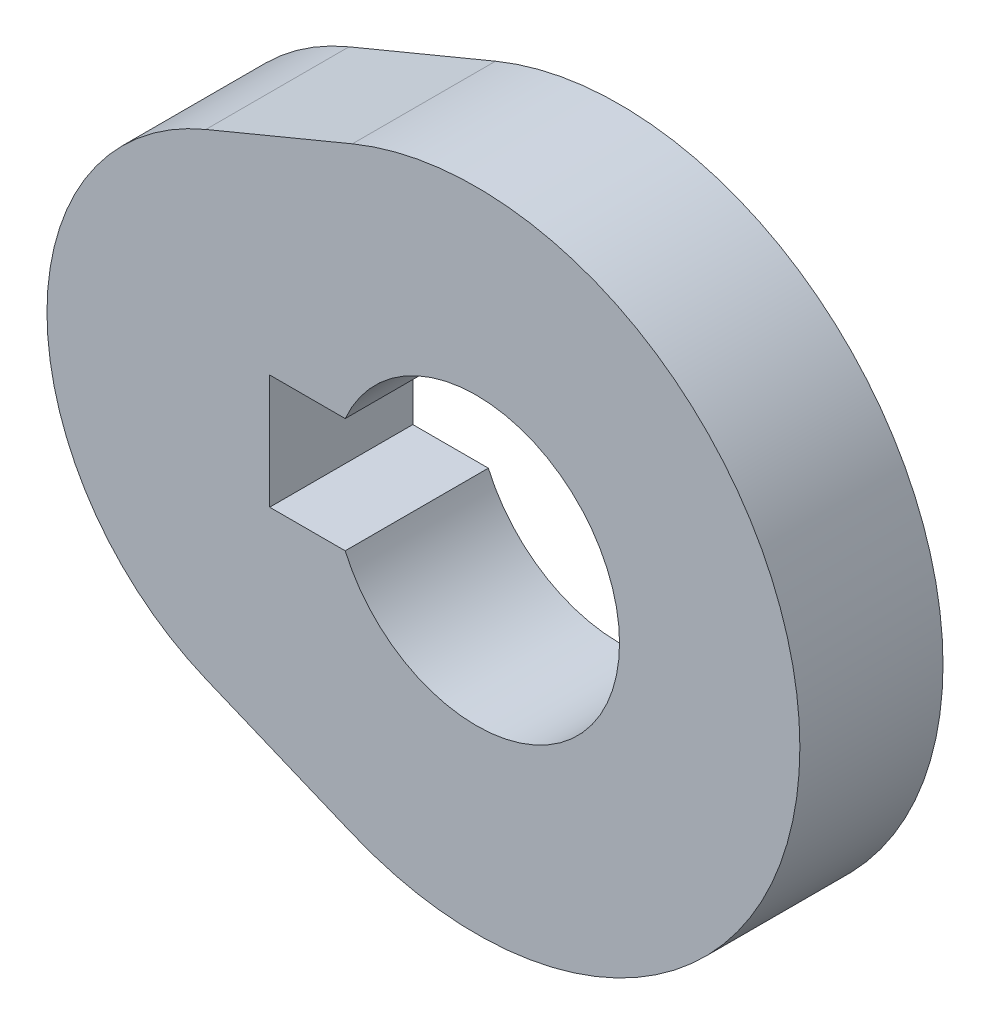
ISO-10303-21;
HEADER;
FILE_DESCRIPTION(('STEP AP214'),'2;1');
FILE_NAME('part.step','',(''),(''),'','','');
FILE_SCHEMA(('AUTOMOTIVE_DESIGN { 1 0 10303 214 1 1 1 1 }'));
ENDSEC;
DATA;
#1=APPLICATION_CONTEXT('core data for automotive mechanical design processes');
#2=APPLICATION_PROTOCOL_DEFINITION('international standard','automotive_design',2000,#1);
#3=PRODUCT_CONTEXT('',#1,'mechanical');
#4=PRODUCT('Part','Part','',(#3));
#5=PRODUCT_RELATED_PRODUCT_CATEGORY('part','',(#4));
#6=PRODUCT_DEFINITION_FORMATION('','',#4);
#7=PRODUCT_DEFINITION_CONTEXT('part definition',#1,'design');
#8=PRODUCT_DEFINITION('design','',#6,#7);
#9=PRODUCT_DEFINITION_SHAPE('','',#8);
#10=(LENGTH_UNIT() NAMED_UNIT(*) SI_UNIT(.MILLI.,.METRE.));
#11=(NAMED_UNIT(*) PLANE_ANGLE_UNIT() SI_UNIT($,.RADIAN.));
#12=(NAMED_UNIT(*) SI_UNIT($,.STERADIAN.) SOLID_ANGLE_UNIT());
#13=UNCERTAINTY_MEASURE_WITH_UNIT(LENGTH_MEASURE(1.E-05),#10,'distance_accuracy_value','');
#14=(GEOMETRIC_REPRESENTATION_CONTEXT(3) GLOBAL_UNCERTAINTY_ASSIGNED_CONTEXT((#13)) GLOBAL_UNIT_ASSIGNED_CONTEXT((#10,
#11,#12)) REPRESENTATION_CONTEXT('',''));
#15=CARTESIAN_POINT('',(0.,0.,0.));
#16=DIRECTION('',(0.,0.,1.));
#17=DIRECTION('',(1.,0.,0.));
#18=AXIS2_PLACEMENT_3D('',#15,#16,#17);
#19=CARTESIAN_POINT('',(-11.3,0.,5.));
#20=DIRECTION('',(0.,0.,-1.));
#21=DIRECTION('',(-1.,0.,0.));
#22=AXIS2_PLACEMENT_3D('',#19,#20,#21);
#23=CYLINDRICAL_SURFACE('',#22,5.);
#24=CARTESIAN_POINT('',(-11.3,0.,0.));
#25=DIRECTION('',(0.,0.,1.));
#26=DIRECTION('',(1.,0.,0.));
#27=AXIS2_PLACEMENT_3D('',#24,#25,#26);
#28=CIRCLE('',#27,5.);
#29=CARTESIAN_POINT('',(-15.8825756949558,-2.,0.));
#30=VERTEX_POINT('',#29);
#31=CARTESIAN_POINT('',(-15.8825756949558,2.,0.));
#32=VERTEX_POINT('',#31);
#33=EDGE_CURVE('E150',#30,#32,#28,.T.);
#34=ORIENTED_EDGE('',*,*,#33,.F.);
#35=DIRECTION('',(0.,0.,-1.));
#36=VECTOR('',#35,1.);
#37=CARTESIAN_POINT('',(-15.8825756949558,-2.,5.));
#38=LINE('',#37,#36);
#39=CARTESIAN_POINT('',(-15.8825756949558,-2.,5.));
#40=VERTEX_POINT('',#39);
#41=EDGE_CURVE('E11',#40,#30,#38,.T.);
#42=ORIENTED_EDGE('',*,*,#41,.F.);
#43=CARTESIAN_POINT('',(-11.3,0.,5.));
#44=DIRECTION('',(0.,0.,1.));
#45=DIRECTION('',(1.,0.,0.));
#46=AXIS2_PLACEMENT_3D('',#43,#44,#45);
#47=CIRCLE('',#46,5.);
#48=CARTESIAN_POINT('',(-15.8825756949558,2.,5.));
#49=VERTEX_POINT('',#48);
#50=EDGE_CURVE('E120',#40,#49,#47,.T.);
#51=ORIENTED_EDGE('',*,*,#50,.T.);
#52=DIRECTION('',(0.,0.,-1.));
#53=VECTOR('',#52,1.);
#54=CARTESIAN_POINT('',(-15.8825756949558,2.,5.));
#55=LINE('',#54,#53);
#56=EDGE_CURVE('E54',#49,#32,#55,.T.);
#57=ORIENTED_EDGE('',*,*,#56,.T.);
#58=EDGE_LOOP('',(#34,#42,#51,#57));
#59=FACE_BOUND('',#58,.T.);
#60=ADVANCED_FACE('F35',(#59),#23,.F.);
#61=CARTESIAN_POINT('',(0.,-2.,5.));
#62=DIRECTION('',(0.,-1.,0.));
#63=DIRECTION('',(1.,0.,0.));
#64=AXIS2_PLACEMENT_3D('',#61,#62,#63);
#65=PLANE('',#64);
#66=DIRECTION('',(-1.,0.,0.));
#67=VECTOR('',#66,1.);
#68=CARTESIAN_POINT('',(0.,-2.,0.));
#69=LINE('',#68,#67);
#70=CARTESIAN_POINT('',(-18.52,-2.,0.));
#71=VERTEX_POINT('',#70);
#72=EDGE_CURVE('E125',#30,#71,#69,.T.);
#73=ORIENTED_EDGE('',*,*,#72,.T.);
#74=DIRECTION('',(0.,0.,-1.));
#75=VECTOR('',#74,1.);
#76=CARTESIAN_POINT('',(-18.52,-2.,5.));
#77=LINE('',#76,#75);
#78=CARTESIAN_POINT('',(-18.52,-2.,5.));
#79=VERTEX_POINT('',#78);
#80=EDGE_CURVE('E45',#79,#71,#77,.T.);
#81=ORIENTED_EDGE('',*,*,#80,.F.);
#82=DIRECTION('',(-1.,0.,0.));
#83=VECTOR('',#82,1.);
#84=CARTESIAN_POINT('',(0.,-2.,5.));
#85=LINE('',#84,#83);
#86=EDGE_CURVE('E115',#40,#79,#85,.T.);
#87=ORIENTED_EDGE('',*,*,#86,.F.);
#88=ORIENTED_EDGE('',*,*,#41,.T.);
#89=EDGE_LOOP('',(#73,#81,#87,#88));
#90=FACE_BOUND('',#89,.T.);
#91=ADVANCED_FACE('F123',(#90),#65,.F.);
#92=CARTESIAN_POINT('',(-18.52,0.,5.));
#93=DIRECTION('',(-1.,0.,0.));
#94=DIRECTION('',(0.,0.,1.));
#95=AXIS2_PLACEMENT_3D('',#92,#93,#94);
#96=PLANE('',#95);
#97=DIRECTION('',(0.,1.,0.));
#98=VECTOR('',#97,1.);
#99=CARTESIAN_POINT('',(-18.52,0.,0.));
#100=LINE('',#99,#98);
#101=CARTESIAN_POINT('',(-18.52,2.,0.));
#102=VERTEX_POINT('',#101);
#103=EDGE_CURVE('E147',#71,#102,#100,.T.);
#104=ORIENTED_EDGE('',*,*,#103,.T.);
#105=DIRECTION('',(0.,0.,-1.));
#106=VECTOR('',#105,1.);
#107=CARTESIAN_POINT('',(-18.52,2.,5.));
#108=LINE('',#107,#106);
#109=CARTESIAN_POINT('',(-18.52,2.,5.));
#110=VERTEX_POINT('',#109);
#111=EDGE_CURVE('E80',#110,#102,#108,.T.);
#112=ORIENTED_EDGE('',*,*,#111,.F.);
#113=DIRECTION('',(0.,1.,0.));
#114=VECTOR('',#113,1.);
#115=CARTESIAN_POINT('',(-18.52,0.,5.));
#116=LINE('',#115,#114);
#117=EDGE_CURVE('E107',#79,#110,#116,.T.);
#118=ORIENTED_EDGE('',*,*,#117,.F.);
#119=ORIENTED_EDGE('',*,*,#80,.T.);
#120=EDGE_LOOP('',(#104,#112,#118,#119));
#121=FACE_BOUND('',#120,.T.);
#122=ADVANCED_FACE('F109',(#121),#96,.F.);
#123=CARTESIAN_POINT('',(-5.99213888888889,14.4375646947137,5.));
#124=DIRECTION('',(-0.383333333333333,0.923610066833161,0.));
#125=DIRECTION('',(-0.923610066833161,-0.383333333333333,0.));
#126=AXIS2_PLACEMENT_3D('',#123,#124,#125);
#127=PLANE('',#126);
#128=DIRECTION('',(0.923610066833161,0.383333333333333,0.));
#129=VECTOR('',#128,1.);
#130=CARTESIAN_POINT('',(-5.99213888888889,14.4375646947137,0.));
#131=LINE('',#130,#129);
#132=CARTESIAN_POINT('',(-20.75,8.31249060149844,0.));
#133=VERTEX_POINT('',#132);
#134=CARTESIAN_POINT('',(-15.6316666666667,10.4367937552147,0.));
#135=VERTEX_POINT('',#134);
#136=EDGE_CURVE('E159',#133,#135,#131,.T.);
#137=ORIENTED_EDGE('',*,*,#136,.F.);
#138=DIRECTION('',(0.,0.,-1.));
#139=VECTOR('',#138,1.);
#140=CARTESIAN_POINT('',(-20.75,8.31249060149844,5.));
#141=LINE('',#140,#139);
#142=CARTESIAN_POINT('',(-20.75,8.31249060149844,5.));
#143=VERTEX_POINT('',#142);
#144=EDGE_CURVE('E39',#143,#133,#141,.T.);
#145=ORIENTED_EDGE('',*,*,#144,.F.);
#146=DIRECTION('',(0.923610066833161,0.383333333333333,0.));
#147=VECTOR('',#146,1.);
#148=CARTESIAN_POINT('',(-5.99213888888889,14.4375646947137,5.));
#149=LINE('',#148,#147);
#150=CARTESIAN_POINT('',(-15.6316666666667,10.4367937552147,5.));
#151=VERTEX_POINT('',#150);
#152=EDGE_CURVE('E146',#143,#151,#149,.T.);
#153=ORIENTED_EDGE('',*,*,#152,.T.);
#154=DIRECTION('',(0.,0.,-1.));
#155=VECTOR('',#154,1.);
#156=CARTESIAN_POINT('',(-15.6316666666667,10.4367937552147,5.));
#157=LINE('',#156,#155);
#158=EDGE_CURVE('E130',#151,#135,#157,.T.);
#159=ORIENTED_EDGE('',*,*,#158,.T.);
#160=EDGE_LOOP('',(#137,#145,#153,#159));
#161=FACE_BOUND('',#160,.T.);
#162=ADVANCED_FACE('F37',(#161),#127,.T.);
#163=CARTESIAN_POINT('',(-17.3,0.,5.));
#164=DIRECTION('',(0.,0.,-1.));
#165=DIRECTION('',(-1.,0.,0.));
#166=AXIS2_PLACEMENT_3D('',#163,#164,#165);
#167=CYLINDRICAL_SURFACE('',#166,9.);
#168=CARTESIAN_POINT('',(-17.3,0.,0.));
#169=DIRECTION('',(0.,0.,1.));
#170=DIRECTION('',(1.,0.,0.));
#171=AXIS2_PLACEMENT_3D('',#168,#169,#170);
#172=CIRCLE('',#171,9.);
#173=CARTESIAN_POINT('',(-20.75,-8.31249060149844,0.));
#174=VERTEX_POINT('',#173);
#175=EDGE_CURVE('E157',#133,#174,#172,.T.);
#176=ORIENTED_EDGE('',*,*,#175,.T.);
#177=DIRECTION('',(0.,0.,-1.));
#178=VECTOR('',#177,1.);
#179=CARTESIAN_POINT('',(-20.75,-8.31249060149844,5.));
#180=LINE('',#179,#178);
#181=CARTESIAN_POINT('',(-20.75,-8.31249060149844,5.));
#182=VERTEX_POINT('',#181);
#183=EDGE_CURVE('E134',#182,#174,#180,.T.);
#184=ORIENTED_EDGE('',*,*,#183,.F.);
#185=CARTESIAN_POINT('',(-17.3,0.,5.));
#186=DIRECTION('',(0.,0.,1.));
#187=DIRECTION('',(1.,0.,0.));
#188=AXIS2_PLACEMENT_3D('',#185,#186,#187);
#189=CIRCLE('',#188,9.);
#190=EDGE_CURVE('E168',#143,#182,#189,.T.);
#191=ORIENTED_EDGE('',*,*,#190,.F.);
#192=ORIENTED_EDGE('',*,*,#144,.T.);
#193=EDGE_LOOP('',(#176,#184,#191,#192));
#194=FACE_BOUND('',#193,.T.);
#195=ADVANCED_FACE('F181',(#194),#167,.T.);
#196=CARTESIAN_POINT('',(-5.99213888888889,-14.4375646947137,5.));
#197=DIRECTION('',(0.383333333333334,0.923610066833161,0.));
#198=DIRECTION('',(-0.923610066833161,0.383333333333334,0.));
#199=AXIS2_PLACEMENT_3D('',#196,#197,#198);
#200=PLANE('',#199);
#201=DIRECTION('',(0.923610066833161,-0.383333333333334,0.));
#202=VECTOR('',#201,1.);
#203=CARTESIAN_POINT('',(-5.99213888888889,-14.4375646947137,0.));
#204=LINE('',#203,#202);
#205=CARTESIAN_POINT('',(-15.6316666666667,-10.4367937552147,0.));
#206=VERTEX_POINT('',#205);
#207=EDGE_CURVE('E155',#174,#206,#204,.T.);
#208=ORIENTED_EDGE('',*,*,#207,.T.);
#209=DIRECTION('',(0.,0.,-1.));
#210=VECTOR('',#209,1.);
#211=CARTESIAN_POINT('',(-15.6316666666667,-10.4367937552147,5.));
#212=LINE('',#211,#210);
#213=CARTESIAN_POINT('',(-15.6316666666667,-10.4367937552147,5.));
#214=VERTEX_POINT('',#213);
#215=EDGE_CURVE('E132',#214,#206,#212,.T.);
#216=ORIENTED_EDGE('',*,*,#215,.F.);
#217=DIRECTION('',(0.923610066833161,-0.383333333333334,0.));
#218=VECTOR('',#217,1.);
#219=CARTESIAN_POINT('',(-5.99213888888889,-14.4375646947137,5.));
#220=LINE('',#219,#218);
#221=EDGE_CURVE('E166',#182,#214,#220,.T.);
#222=ORIENTED_EDGE('',*,*,#221,.F.);
#223=ORIENTED_EDGE('',*,*,#183,.T.);
#224=EDGE_LOOP('',(#208,#216,#222,#223));
#225=FACE_BOUND('',#224,.T.);
#226=ADVANCED_FACE('F182',(#225),#200,.F.);
#227=CARTESIAN_POINT('',(-11.3,0.,5.));
#228=DIRECTION('',(0.,0.,-1.));
#229=DIRECTION('',(-1.,0.,0.));
#230=AXIS2_PLACEMENT_3D('',#227,#228,#229);
#231=CYLINDRICAL_SURFACE('',#230,11.3);
#232=CARTESIAN_POINT('',(-11.3,0.,0.));
#233=DIRECTION('',(0.,0.,1.));
#234=DIRECTION('',(1.,0.,0.));
#235=AXIS2_PLACEMENT_3D('',#232,#233,#234);
#236=CIRCLE('',#235,11.3);
#237=EDGE_CURVE('E152',#206,#135,#236,.T.);
#238=ORIENTED_EDGE('',*,*,#237,.T.);
#239=ORIENTED_EDGE('',*,*,#158,.F.);
#240=CARTESIAN_POINT('',(-11.3,0.,5.));
#241=DIRECTION('',(0.,0.,1.));
#242=DIRECTION('',(1.,0.,0.));
#243=AXIS2_PLACEMENT_3D('',#240,#241,#242);
#244=CIRCLE('',#243,11.3);
#245=EDGE_CURVE('E164',#214,#151,#244,.T.);
#246=ORIENTED_EDGE('',*,*,#245,.F.);
#247=ORIENTED_EDGE('',*,*,#215,.T.);
#248=EDGE_LOOP('',(#238,#239,#246,#247));
#249=FACE_BOUND('',#248,.T.);
#250=ADVANCED_FACE('F176',(#249),#231,.T.);
#251=CARTESIAN_POINT('',(0.,2.,5.));
#252=DIRECTION('',(0.,-1.,0.));
#253=DIRECTION('',(0.,0.,-1.));
#254=AXIS2_PLACEMENT_3D('',#251,#252,#253);
#255=PLANE('',#254);
#256=DIRECTION('',(-1.,0.,0.));
#257=VECTOR('',#256,1.);
#258=CARTESIAN_POINT('',(0.,2.,0.));
#259=LINE('',#258,#257);
#260=EDGE_CURVE('E143',#32,#102,#259,.T.);
#261=ORIENTED_EDGE('',*,*,#260,.F.);
#262=ORIENTED_EDGE('',*,*,#56,.F.);
#263=DIRECTION('',(-1.,0.,0.));
#264=VECTOR('',#263,1.);
#265=CARTESIAN_POINT('',(0.,2.,5.));
#266=LINE('',#265,#264);
#267=EDGE_CURVE('E114',#49,#110,#266,.T.);
#268=ORIENTED_EDGE('',*,*,#267,.T.);
#269=ORIENTED_EDGE('',*,*,#111,.T.);
#270=EDGE_LOOP('',(#261,#262,#268,#269));
#271=FACE_BOUND('',#270,.T.);
#272=ADVANCED_FACE('F189',(#271),#255,.T.);
#273=CARTESIAN_POINT('',(0.,0.,5.));
#274=DIRECTION('',(0.,0.,1.));
#275=DIRECTION('',(1.,0.,0.));
#276=AXIS2_PLACEMENT_3D('',#273,#274,#275);
#277=PLANE('',#276);
#278=ORIENTED_EDGE('',*,*,#152,.F.);
#279=ORIENTED_EDGE('',*,*,#190,.T.);
#280=ORIENTED_EDGE('',*,*,#221,.T.);
#281=ORIENTED_EDGE('',*,*,#245,.T.);
#282=EDGE_LOOP('',(#278,#279,#280,#281));
#283=FACE_BOUND('',#282,.T.);
#284=ORIENTED_EDGE('',*,*,#50,.F.);
#285=ORIENTED_EDGE('',*,*,#86,.T.);
#286=ORIENTED_EDGE('',*,*,#117,.T.);
#287=ORIENTED_EDGE('',*,*,#267,.F.);
#288=EDGE_LOOP('',(#284,#285,#286,#287));
#289=FACE_BOUND('',#288,.T.);
#290=ADVANCED_FACE('F119',(#283,#289),#277,.T.);
#291=CARTESIAN_POINT('',(0.,0.,0.));
#292=DIRECTION('',(0.,0.,1.));
#293=DIRECTION('',(1.,0.,0.));
#294=AXIS2_PLACEMENT_3D('',#291,#292,#293);
#295=PLANE('',#294);
#296=ORIENTED_EDGE('',*,*,#136,.T.);
#297=ORIENTED_EDGE('',*,*,#237,.F.);
#298=ORIENTED_EDGE('',*,*,#207,.F.);
#299=ORIENTED_EDGE('',*,*,#175,.F.);
#300=EDGE_LOOP('',(#296,#297,#298,#299));
#301=FACE_BOUND('',#300,.T.);
#302=ORIENTED_EDGE('',*,*,#33,.T.);
#303=ORIENTED_EDGE('',*,*,#260,.T.);
#304=ORIENTED_EDGE('',*,*,#103,.F.);
#305=ORIENTED_EDGE('',*,*,#72,.F.);
#306=EDGE_LOOP('',(#302,#303,#304,#305));
#307=FACE_BOUND('',#306,.T.);
#308=ADVANCED_FACE('F179',(#301,#307),#295,.F.);
#309=CLOSED_SHELL('',(#60,#91,#122,#162,#195,#226,#250,#272,#290,#308));
#310=MANIFOLD_SOLID_BREP('B2',#309);
#311=ADVANCED_BREP_SHAPE_REPRESENTATION('',(#18,#310),#14);
#312=SHAPE_DEFINITION_REPRESENTATION(#9,#311);
ENDSEC;
END-ISO-10303-21;
